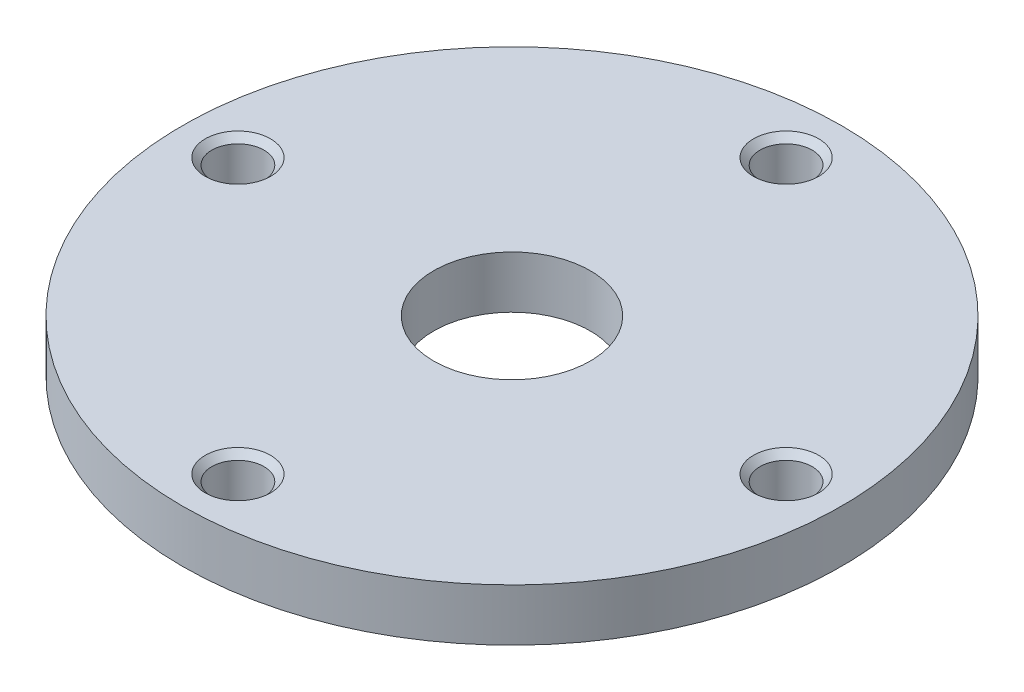
ISO-10303-21;
HEADER;
FILE_DESCRIPTION(('STEP AP214'),'2;1');
FILE_NAME('part.step','',(''),(''),'','','');
FILE_SCHEMA(('AUTOMOTIVE_DESIGN { 1 0 10303 214 1 1 1 1 }'));
ENDSEC;
DATA;
#1=APPLICATION_CONTEXT('core data for automotive mechanical design processes');
#2=APPLICATION_PROTOCOL_DEFINITION('international standard','automotive_design',2000,#1);
#3=PRODUCT_CONTEXT('',#1,'mechanical');
#4=PRODUCT('Part','Part','',(#3));
#5=PRODUCT_RELATED_PRODUCT_CATEGORY('part','',(#4));
#6=PRODUCT_DEFINITION_FORMATION('','',#4);
#7=PRODUCT_DEFINITION_CONTEXT('part definition',#1,'design');
#8=PRODUCT_DEFINITION('design','',#6,#7);
#9=PRODUCT_DEFINITION_SHAPE('','',#8);
#10=(LENGTH_UNIT() NAMED_UNIT(*) SI_UNIT(.MILLI.,.METRE.));
#11=(NAMED_UNIT(*) PLANE_ANGLE_UNIT() SI_UNIT($,.RADIAN.));
#12=(NAMED_UNIT(*) SI_UNIT($,.STERADIAN.) SOLID_ANGLE_UNIT());
#13=UNCERTAINTY_MEASURE_WITH_UNIT(LENGTH_MEASURE(1.E-05),#10,'distance_accuracy_value','');
#14=(GEOMETRIC_REPRESENTATION_CONTEXT(3) GLOBAL_UNCERTAINTY_ASSIGNED_CONTEXT((#13)) GLOBAL_UNIT_ASSIGNED_CONTEXT((#10,
#11,#12)) REPRESENTATION_CONTEXT('',''));
#15=CARTESIAN_POINT('',(0.,0.,0.));
#16=DIRECTION('',(0.,0.,1.));
#17=DIRECTION('',(1.,0.,0.));
#18=AXIS2_PLACEMENT_3D('',#15,#16,#17);
#19=CARTESIAN_POINT('',(0.,2.,0.));
#20=DIRECTION('',(0.,-1.,0.));
#21=DIRECTION('',(0.,0.,-1.));
#22=AXIS2_PLACEMENT_3D('',#19,#20,#21);
#23=CYLINDRICAL_SURFACE('',#22,12.625);
#24=CARTESIAN_POINT('',(0.,2.,0.));
#25=DIRECTION('',(0.,1.,0.));
#26=DIRECTION('',(0.,0.,1.));
#27=AXIS2_PLACEMENT_3D('',#24,#25,#26);
#28=CIRCLE('',#27,12.625);
#29=CARTESIAN_POINT('',(0.,2.,12.625));
#30=VERTEX_POINT('',#29);
#31=EDGE_CURVE('E73',#30,#30,#28,.T.);
#32=ORIENTED_EDGE('',*,*,#31,.F.);
#33=EDGE_LOOP('',(#32));
#34=FACE_BOUND('',#33,.T.);
#35=CARTESIAN_POINT('',(0.,0.,0.));
#36=DIRECTION('',(0.,1.,0.));
#37=DIRECTION('',(0.,0.,1.));
#38=AXIS2_PLACEMENT_3D('',#35,#36,#37);
#39=CIRCLE('',#38,12.625);
#40=CARTESIAN_POINT('',(0.,0.,12.625));
#41=VERTEX_POINT('',#40);
#42=EDGE_CURVE('E74',#41,#41,#39,.T.);
#43=ORIENTED_EDGE('',*,*,#42,.T.);
#44=EDGE_LOOP('',(#43));
#45=FACE_BOUND('',#44,.T.);
#46=ADVANCED_FACE('F40',(#34,#45),#23,.T.);
#47=CARTESIAN_POINT('',(0.,2.,0.));
#48=DIRECTION('',(0.,1.,0.));
#49=DIRECTION('',(0.,0.,1.));
#50=AXIS2_PLACEMENT_3D('',#47,#48,#49);
#51=PLANE('',#50);
#52=CARTESIAN_POINT('',(0.,2.,0.));
#53=DIRECTION('',(0.,1.,0.));
#54=DIRECTION('',(0.,0.,1.));
#55=AXIS2_PLACEMENT_3D('',#52,#53,#54);
#56=CIRCLE('',#55,3.);
#57=CARTESIAN_POINT('',(0.,2.,3.));
#58=VERTEX_POINT('',#57);
#59=EDGE_CURVE('E91',#58,#58,#56,.T.);
#60=ORIENTED_EDGE('',*,*,#59,.F.);
#61=EDGE_LOOP('',(#60));
#62=FACE_BOUND('',#61,.T.);
#63=CARTESIAN_POINT('',(0.,2.,10.5));
#64=DIRECTION('',(0.,1.,0.));
#65=DIRECTION('',(0.,0.,1.));
#66=AXIS2_PLACEMENT_3D('',#63,#64,#65);
#67=CIRCLE('',#66,1.25);
#68=CARTESIAN_POINT('',(0.,2.,11.75));
#69=VERTEX_POINT('',#68);
#70=EDGE_CURVE('E58',#69,#69,#67,.F.);
#71=ORIENTED_EDGE('',*,*,#70,.T.);
#72=EDGE_LOOP('',(#71));
#73=FACE_BOUND('',#72,.T.);
#74=CARTESIAN_POINT('',(-10.5,2.,-1.09981662173559E-13));
#75=DIRECTION('',(0.,1.,0.));
#76=DIRECTION('',(0.,0.,1.));
#77=AXIS2_PLACEMENT_3D('',#74,#75,#76);
#78=CIRCLE('',#77,1.25);
#79=CARTESIAN_POINT('',(-10.5,2.,1.24999999999989));
#80=VERTEX_POINT('',#79);
#81=EDGE_CURVE('E61',#80,#80,#78,.F.);
#82=ORIENTED_EDGE('',*,*,#81,.T.);
#83=EDGE_LOOP('',(#82));
#84=FACE_BOUND('',#83,.T.);
#85=CARTESIAN_POINT('',(10.5,2.,0.));
#86=DIRECTION('',(0.,1.,0.));
#87=DIRECTION('',(0.,0.,1.));
#88=AXIS2_PLACEMENT_3D('',#85,#86,#87);
#89=CIRCLE('',#88,1.25000000000001);
#90=CARTESIAN_POINT('',(10.5,2.,1.25000000000004));
#91=VERTEX_POINT('',#90);
#92=EDGE_CURVE('E64',#91,#91,#89,.F.);
#93=ORIENTED_EDGE('',*,*,#92,.T.);
#94=EDGE_LOOP('',(#93));
#95=FACE_BOUND('',#94,.T.);
#96=CARTESIAN_POINT('',(0.,2.,-10.5));
#97=DIRECTION('',(0.,1.,0.));
#98=DIRECTION('',(0.,0.,1.));
#99=AXIS2_PLACEMENT_3D('',#96,#97,#98);
#100=CIRCLE('',#99,1.25);
#101=CARTESIAN_POINT('',(0.,2.,-9.25));
#102=VERTEX_POINT('',#101);
#103=EDGE_CURVE('E67',#102,#102,#100,.F.);
#104=ORIENTED_EDGE('',*,*,#103,.T.);
#105=EDGE_LOOP('',(#104));
#106=FACE_BOUND('',#105,.T.);
#107=ORIENTED_EDGE('',*,*,#31,.T.);
#108=EDGE_LOOP('',(#107));
#109=FACE_BOUND('',#108,.T.);
#110=ADVANCED_FACE('F112',(#62,#73,#84,#95,#106,#109),#51,.T.);
#111=CARTESIAN_POINT('',(0.,0.,0.));
#112=DIRECTION('',(0.,1.,0.));
#113=DIRECTION('',(0.,0.,1.));
#114=AXIS2_PLACEMENT_3D('',#111,#112,#113);
#115=PLANE('',#114);
#116=CARTESIAN_POINT('',(0.,0.,0.));
#117=DIRECTION('',(0.,1.,0.));
#118=DIRECTION('',(0.,0.,1.));
#119=AXIS2_PLACEMENT_3D('',#116,#117,#118);
#120=CIRCLE('',#119,3.);
#121=CARTESIAN_POINT('',(0.,0.,3.));
#122=VERTEX_POINT('',#121);
#123=EDGE_CURVE('E45',#122,#122,#120,.T.);
#124=ORIENTED_EDGE('',*,*,#123,.T.);
#125=EDGE_LOOP('',(#124));
#126=FACE_BOUND('',#125,.T.);
#127=CARTESIAN_POINT('',(-10.5,0.,-1.09981662173559E-13));
#128=DIRECTION('',(0.,1.,0.));
#129=DIRECTION('',(0.,0.,1.));
#130=AXIS2_PLACEMENT_3D('',#127,#128,#129);
#131=CIRCLE('',#130,0.999999999999999);
#132=CARTESIAN_POINT('',(-10.5,0.,0.999999999999889));
#133=VERTEX_POINT('',#132);
#134=EDGE_CURVE('E88',#133,#133,#131,.T.);
#135=ORIENTED_EDGE('',*,*,#134,.T.);
#136=EDGE_LOOP('',(#135));
#137=FACE_BOUND('',#136,.T.);
#138=CARTESIAN_POINT('',(0.,0.,-10.5));
#139=DIRECTION('',(0.,1.,0.));
#140=DIRECTION('',(0.,0.,1.));
#141=AXIS2_PLACEMENT_3D('',#138,#139,#140);
#142=CIRCLE('',#141,1.);
#143=CARTESIAN_POINT('',(0.,0.,-9.5));
#144=VERTEX_POINT('',#143);
#145=EDGE_CURVE('E85',#144,#144,#142,.T.);
#146=ORIENTED_EDGE('',*,*,#145,.T.);
#147=EDGE_LOOP('',(#146));
#148=FACE_BOUND('',#147,.T.);
#149=CARTESIAN_POINT('',(10.5,0.,0.));
#150=DIRECTION('',(0.,1.,0.));
#151=DIRECTION('',(0.,0.,1.));
#152=AXIS2_PLACEMENT_3D('',#149,#150,#151);
#153=CIRCLE('',#152,0.999999999999999);
#154=CARTESIAN_POINT('',(10.5,0.,1.00000000000004));
#155=VERTEX_POINT('',#154);
#156=EDGE_CURVE('E82',#155,#155,#153,.T.);
#157=ORIENTED_EDGE('',*,*,#156,.T.);
#158=EDGE_LOOP('',(#157));
#159=FACE_BOUND('',#158,.T.);
#160=CARTESIAN_POINT('',(0.,0.,10.5));
#161=DIRECTION('',(0.,1.,0.));
#162=DIRECTION('',(0.,0.,1.));
#163=AXIS2_PLACEMENT_3D('',#160,#161,#162);
#164=CIRCLE('',#163,1.);
#165=CARTESIAN_POINT('',(0.,0.,11.5));
#166=VERTEX_POINT('',#165);
#167=EDGE_CURVE('E77',#166,#166,#164,.T.);
#168=ORIENTED_EDGE('',*,*,#167,.T.);
#169=EDGE_LOOP('',(#168));
#170=FACE_BOUND('',#169,.T.);
#171=ORIENTED_EDGE('',*,*,#42,.F.);
#172=EDGE_LOOP('',(#171));
#173=FACE_BOUND('',#172,.T.);
#174=ADVANCED_FACE('F98',(#126,#137,#148,#159,#170,#173),#115,.F.);
#175=CARTESIAN_POINT('',(0.,2.,10.5));
#176=DIRECTION('',(0.,1.,0.));
#177=DIRECTION('',(0.,0.,1.));
#178=AXIS2_PLACEMENT_3D('',#175,#176,#177);
#179=CYLINDRICAL_SURFACE('',#178,1.);
#180=CARTESIAN_POINT('',(0.,1.75,10.5));
#181=DIRECTION('',(0.,1.,0.));
#182=DIRECTION('',(0.,0.,1.));
#183=AXIS2_PLACEMENT_3D('',#180,#181,#182);
#184=CIRCLE('',#183,1.);
#185=CARTESIAN_POINT('',(0.,1.75,11.5));
#186=VERTEX_POINT('',#185);
#187=EDGE_CURVE('E70',#186,#186,#184,.T.);
#188=ORIENTED_EDGE('',*,*,#187,.T.);
#189=EDGE_LOOP('',(#188));
#190=FACE_BOUND('',#189,.T.);
#191=ORIENTED_EDGE('',*,*,#167,.F.);
#192=EDGE_LOOP('',(#191));
#193=FACE_BOUND('',#192,.T.);
#194=ADVANCED_FACE('F154',(#190,#193),#179,.F.);
#195=CARTESIAN_POINT('',(10.5,2.,0.));
#196=DIRECTION('',(0.,1.,0.));
#197=DIRECTION('',(0.,0.,1.));
#198=AXIS2_PLACEMENT_3D('',#195,#196,#197);
#199=CYLINDRICAL_SURFACE('',#198,0.999999999999999);
#200=CARTESIAN_POINT('',(10.5,1.74999999999999,0.));
#201=DIRECTION('',(0.,1.,0.));
#202=DIRECTION('',(0.,0.,1.));
#203=AXIS2_PLACEMENT_3D('',#200,#201,#202);
#204=CIRCLE('',#203,0.999999999999999);
#205=CARTESIAN_POINT('',(10.5,1.74999999999999,1.00000000000004));
#206=VERTEX_POINT('',#205);
#207=EDGE_CURVE('E49',#206,#206,#204,.T.);
#208=ORIENTED_EDGE('',*,*,#207,.T.);
#209=EDGE_LOOP('',(#208));
#210=FACE_BOUND('',#209,.T.);
#211=ORIENTED_EDGE('',*,*,#156,.F.);
#212=EDGE_LOOP('',(#211));
#213=FACE_BOUND('',#212,.T.);
#214=ADVANCED_FACE('F150',(#210,#213),#199,.F.);
#215=CARTESIAN_POINT('',(0.,2.,-10.5));
#216=DIRECTION('',(0.,1.,0.));
#217=DIRECTION('',(0.,0.,1.));
#218=AXIS2_PLACEMENT_3D('',#215,#216,#217);
#219=CYLINDRICAL_SURFACE('',#218,1.);
#220=CARTESIAN_POINT('',(0.,1.75,-10.5));
#221=DIRECTION('',(0.,1.,0.));
#222=DIRECTION('',(0.,0.,1.));
#223=AXIS2_PLACEMENT_3D('',#220,#221,#222);
#224=CIRCLE('',#223,1.);
#225=CARTESIAN_POINT('',(0.,1.75,-9.5));
#226=VERTEX_POINT('',#225);
#227=EDGE_CURVE('E10',#226,#226,#224,.T.);
#228=ORIENTED_EDGE('',*,*,#227,.T.);
#229=EDGE_LOOP('',(#228));
#230=FACE_BOUND('',#229,.T.);
#231=ORIENTED_EDGE('',*,*,#145,.F.);
#232=EDGE_LOOP('',(#231));
#233=FACE_BOUND('',#232,.T.);
#234=ADVANCED_FACE('F153',(#230,#233),#219,.F.);
#235=CARTESIAN_POINT('',(-10.5,2.,-1.09981662173559E-13));
#236=DIRECTION('',(0.,1.,0.));
#237=DIRECTION('',(0.,0.,1.));
#238=AXIS2_PLACEMENT_3D('',#235,#236,#237);
#239=CYLINDRICAL_SURFACE('',#238,0.999999999999999);
#240=CARTESIAN_POINT('',(-10.5,1.75,-1.09981662173559E-13));
#241=DIRECTION('',(0.,1.,0.));
#242=DIRECTION('',(0.,0.,1.));
#243=AXIS2_PLACEMENT_3D('',#240,#241,#242);
#244=CIRCLE('',#243,0.999999999999999);
#245=CARTESIAN_POINT('',(-10.5,1.75,0.999999999999889));
#246=VERTEX_POINT('',#245);
#247=EDGE_CURVE('E53',#246,#246,#244,.T.);
#248=ORIENTED_EDGE('',*,*,#247,.T.);
#249=EDGE_LOOP('',(#248));
#250=FACE_BOUND('',#249,.T.);
#251=ORIENTED_EDGE('',*,*,#134,.F.);
#252=EDGE_LOOP('',(#251));
#253=FACE_BOUND('',#252,.T.);
#254=ADVANCED_FACE('F133',(#250,#253),#239,.F.);
#255=CARTESIAN_POINT('',(0.,1.75,10.5));
#256=DIRECTION('',(0.,1.,0.));
#257=DIRECTION('',(0.,0.,1.));
#258=AXIS2_PLACEMENT_3D('',#255,#256,#257);
#259=CONICAL_SURFACE('',#258,1.,0.785398163397448);
#260=ORIENTED_EDGE('',*,*,#70,.F.);
#261=EDGE_LOOP('',(#260));
#262=FACE_BOUND('',#261,.T.);
#263=ORIENTED_EDGE('',*,*,#187,.F.);
#264=EDGE_LOOP('',(#263));
#265=FACE_BOUND('',#264,.T.);
#266=ADVANCED_FACE('F126',(#262,#265),#259,.F.);
#267=CARTESIAN_POINT('',(-10.5,1.75,-1.09981662173559E-13));
#268=DIRECTION('',(0.,1.,0.));
#269=DIRECTION('',(0.,0.,1.));
#270=AXIS2_PLACEMENT_3D('',#267,#268,#269);
#271=CONICAL_SURFACE('',#270,0.999999999999999,0.785398163397448);
#272=ORIENTED_EDGE('',*,*,#81,.F.);
#273=EDGE_LOOP('',(#272));
#274=FACE_BOUND('',#273,.T.);
#275=ORIENTED_EDGE('',*,*,#247,.F.);
#276=EDGE_LOOP('',(#275));
#277=FACE_BOUND('',#276,.T.);
#278=ADVANCED_FACE('F132',(#274,#277),#271,.F.);
#279=CARTESIAN_POINT('',(10.5,1.74999999999999,0.));
#280=DIRECTION('',(0.,1.,0.));
#281=DIRECTION('',(0.,0.,1.));
#282=AXIS2_PLACEMENT_3D('',#279,#280,#281);
#283=CONICAL_SURFACE('',#282,0.999999999999999,0.785398163397455);
#284=ORIENTED_EDGE('',*,*,#92,.F.);
#285=EDGE_LOOP('',(#284));
#286=FACE_BOUND('',#285,.T.);
#287=ORIENTED_EDGE('',*,*,#207,.F.);
#288=EDGE_LOOP('',(#287));
#289=FACE_BOUND('',#288,.T.);
#290=ADVANCED_FACE('F108',(#286,#289),#283,.F.);
#291=CARTESIAN_POINT('',(0.,1.75,-10.5));
#292=DIRECTION('',(0.,1.,0.));
#293=DIRECTION('',(0.,0.,1.));
#294=AXIS2_PLACEMENT_3D('',#291,#292,#293);
#295=CONICAL_SURFACE('',#294,1.,0.785398163397448);
#296=ORIENTED_EDGE('',*,*,#103,.F.);
#297=EDGE_LOOP('',(#296));
#298=FACE_BOUND('',#297,.T.);
#299=ORIENTED_EDGE('',*,*,#227,.F.);
#300=EDGE_LOOP('',(#299));
#301=FACE_BOUND('',#300,.T.);
#302=ADVANCED_FACE('F43',(#298,#301),#295,.F.);
#303=CARTESIAN_POINT('',(0.,-8.,0.));
#304=DIRECTION('',(0.,1.,0.));
#305=DIRECTION('',(0.,0.,1.));
#306=AXIS2_PLACEMENT_3D('',#303,#304,#305);
#307=CYLINDRICAL_SURFACE('',#306,3.);
#308=ORIENTED_EDGE('',*,*,#59,.T.);
#309=EDGE_LOOP('',(#308));
#310=FACE_BOUND('',#309,.T.);
#311=ORIENTED_EDGE('',*,*,#123,.F.);
#312=EDGE_LOOP('',(#311));
#313=FACE_BOUND('',#312,.T.);
#314=ADVANCED_FACE('F101',(#310,#313),#307,.F.);
#315=CLOSED_SHELL('',(#46,#110,#174,#194,#214,#234,#254,#266,#278,#290,#302,#314));
#316=MANIFOLD_SOLID_BREP('B2',#315);
#317=ADVANCED_BREP_SHAPE_REPRESENTATION('',(#18,#316),#14);
#318=SHAPE_DEFINITION_REPRESENTATION(#9,#317);
ENDSEC;
END-ISO-10303-21;
